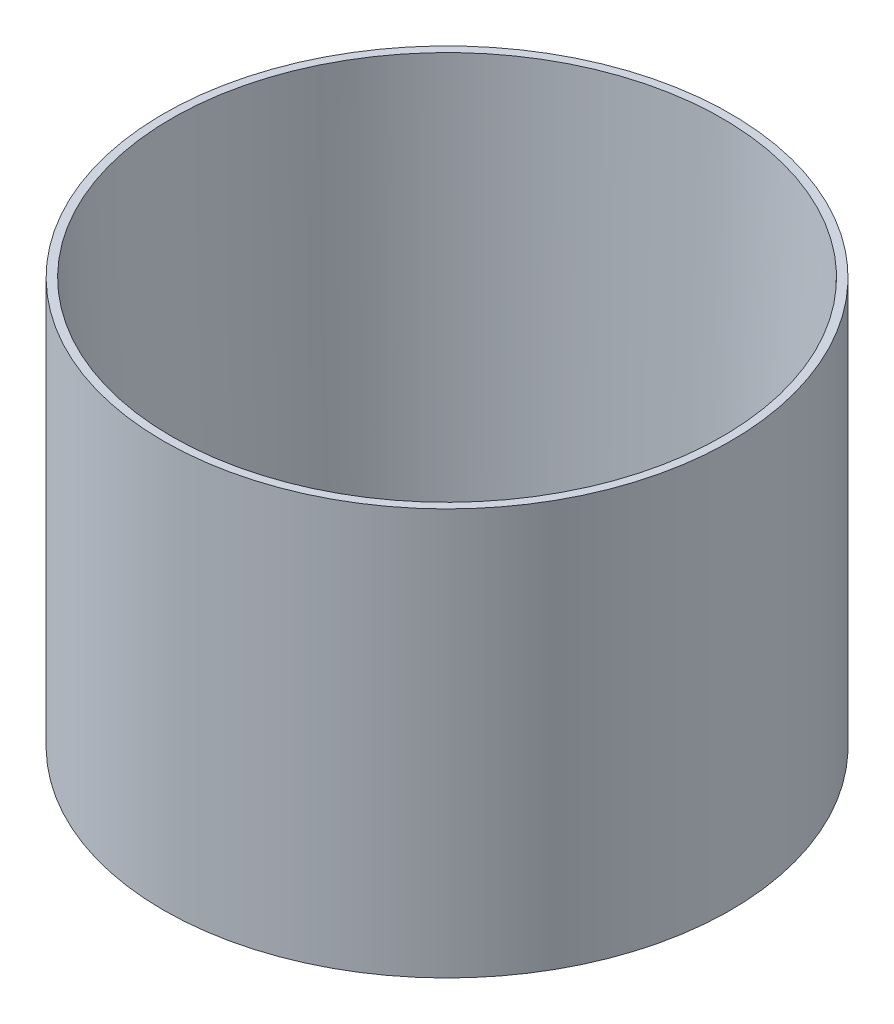
ISO-10303-21;
HEADER;
FILE_DESCRIPTION(('STEP AP214'),'2;1');
FILE_NAME('part.step','',(''),(''),'','','');
FILE_SCHEMA(('AUTOMOTIVE_DESIGN { 1 0 10303 214 1 1 1 1 }'));
ENDSEC;
DATA;
#1=APPLICATION_CONTEXT('core data for automotive mechanical design processes');
#2=APPLICATION_PROTOCOL_DEFINITION('international standard','automotive_design',2000,#1);
#3=PRODUCT_CONTEXT('',#1,'mechanical');
#4=PRODUCT('Part','Part','',(#3));
#5=PRODUCT_RELATED_PRODUCT_CATEGORY('part','',(#4));
#6=PRODUCT_DEFINITION_FORMATION('','',#4);
#7=PRODUCT_DEFINITION_CONTEXT('part definition',#1,'design');
#8=PRODUCT_DEFINITION('design','',#6,#7);
#9=PRODUCT_DEFINITION_SHAPE('','',#8);
#10=(LENGTH_UNIT() NAMED_UNIT(*) SI_UNIT(.MILLI.,.METRE.));
#11=(NAMED_UNIT(*) PLANE_ANGLE_UNIT() SI_UNIT($,.RADIAN.));
#12=(NAMED_UNIT(*) SI_UNIT($,.STERADIAN.) SOLID_ANGLE_UNIT());
#13=UNCERTAINTY_MEASURE_WITH_UNIT(LENGTH_MEASURE(1.E-05),#10,'distance_accuracy_value','');
#14=(GEOMETRIC_REPRESENTATION_CONTEXT(3) GLOBAL_UNCERTAINTY_ASSIGNED_CONTEXT((#13)) GLOBAL_UNIT_ASSIGNED_CONTEXT((#10,
#11,#12)) REPRESENTATION_CONTEXT('',''));
#15=CARTESIAN_POINT('',(0.,0.,0.));
#16=DIRECTION('',(0.,0.,1.));
#17=DIRECTION('',(1.,0.,0.));
#18=AXIS2_PLACEMENT_3D('',#15,#16,#17);
#19=CARTESIAN_POINT('',(0.,25.,0.));
#20=DIRECTION('',(0.,1.,0.));
#21=DIRECTION('',(0.,0.,1.));
#22=AXIS2_PLACEMENT_3D('',#19,#20,#21);
#23=PLANE('',#22);
#24=CARTESIAN_POINT('',(0.,25.,0.));
#25=DIRECTION('',(0.,1.,0.));
#26=DIRECTION('',(0.,0.,1.));
#27=AXIS2_PLACEMENT_3D('',#24,#25,#26);
#28=CIRCLE('',#27,16.95);
#29=CARTESIAN_POINT('',(0.,25.,16.95));
#30=VERTEX_POINT('',#29);
#31=EDGE_CURVE('E10',#30,#30,#28,.F.);
#32=ORIENTED_EDGE('',*,*,#31,.T.);
#33=EDGE_LOOP('',(#32));
#34=FACE_BOUND('',#33,.T.);
#35=CARTESIAN_POINT('',(0.,25.,0.));
#36=DIRECTION('',(0.,1.,0.));
#37=DIRECTION('',(0.,0.,1.));
#38=AXIS2_PLACEMENT_3D('',#35,#36,#37);
#39=CIRCLE('',#38,17.45);
#40=CARTESIAN_POINT('',(0.,25.,17.45));
#41=VERTEX_POINT('',#40);
#42=EDGE_CURVE('E41',#41,#41,#39,.T.);
#43=ORIENTED_EDGE('',*,*,#42,.T.);
#44=EDGE_LOOP('',(#43));
#45=FACE_BOUND('',#44,.T.);
#46=ADVANCED_FACE('F33',(#34,#45),#23,.T.);
#47=CARTESIAN_POINT('',(0.,0.,0.));
#48=DIRECTION('',(0.,1.,0.));
#49=DIRECTION('',(0.,0.,1.));
#50=AXIS2_PLACEMENT_3D('',#47,#48,#49);
#51=PLANE('',#50);
#52=CARTESIAN_POINT('',(0.,0.,0.));
#53=DIRECTION('',(0.,1.,0.));
#54=DIRECTION('',(0.,0.,1.));
#55=AXIS2_PLACEMENT_3D('',#52,#53,#54);
#56=CIRCLE('',#55,17.45);
#57=CARTESIAN_POINT('',(0.,0.,17.45));
#58=VERTEX_POINT('',#57);
#59=EDGE_CURVE('E45',#58,#58,#56,.T.);
#60=ORIENTED_EDGE('',*,*,#59,.F.);
#61=EDGE_LOOP('',(#60));
#62=FACE_BOUND('',#61,.T.);
#63=CARTESIAN_POINT('',(0.,0.,0.));
#64=DIRECTION('',(0.,1.,0.));
#65=DIRECTION('',(0.,0.,1.));
#66=AXIS2_PLACEMENT_3D('',#63,#64,#65);
#67=CIRCLE('',#66,16.25);
#68=CARTESIAN_POINT('',(0.,0.,16.25));
#69=VERTEX_POINT('',#68);
#70=EDGE_CURVE('E50',#69,#69,#67,.T.);
#71=ORIENTED_EDGE('',*,*,#70,.T.);
#72=EDGE_LOOP('',(#71));
#73=FACE_BOUND('',#72,.T.);
#74=ADVANCED_FACE('F55',(#62,#73),#51,.F.);
#75=CARTESIAN_POINT('',(0.,25.,0.));
#76=DIRECTION('',(0.,-1.,0.));
#77=DIRECTION('',(0.,0.,-1.));
#78=AXIS2_PLACEMENT_3D('',#75,#76,#77);
#79=CYLINDRICAL_SURFACE('',#78,17.45);
#80=ORIENTED_EDGE('',*,*,#42,.F.);
#81=EDGE_LOOP('',(#80));
#82=FACE_BOUND('',#81,.T.);
#83=ORIENTED_EDGE('',*,*,#59,.T.);
#84=EDGE_LOOP('',(#83));
#85=FACE_BOUND('',#84,.T.);
#86=ADVANCED_FACE('F58',(#82,#85),#79,.T.);
#87=CARTESIAN_POINT('',(0.,-1.77635683940025E-12,0.));
#88=DIRECTION('',(0.,1.,0.));
#89=DIRECTION('',(0.,0.,1.));
#90=AXIS2_PLACEMENT_3D('',#87,#88,#89);
#91=CONICAL_SURFACE('',#90,16.25,0.0279926861068103);
#92=ORIENTED_EDGE('',*,*,#31,.F.);
#93=EDGE_LOOP('',(#92));
#94=FACE_BOUND('',#93,.T.);
#95=ORIENTED_EDGE('',*,*,#70,.F.);
#96=EDGE_LOOP('',(#95));
#97=FACE_BOUND('',#96,.T.);
#98=ADVANCED_FACE('F36',(#94,#97),#91,.F.);
#99=CLOSED_SHELL('',(#46,#74,#86,#98));
#100=MANIFOLD_SOLID_BREP('B2',#99);
#101=ADVANCED_BREP_SHAPE_REPRESENTATION('',(#18,#100),#14);
#102=SHAPE_DEFINITION_REPRESENTATION(#9,#101);
ENDSEC;
END-ISO-10303-21;
